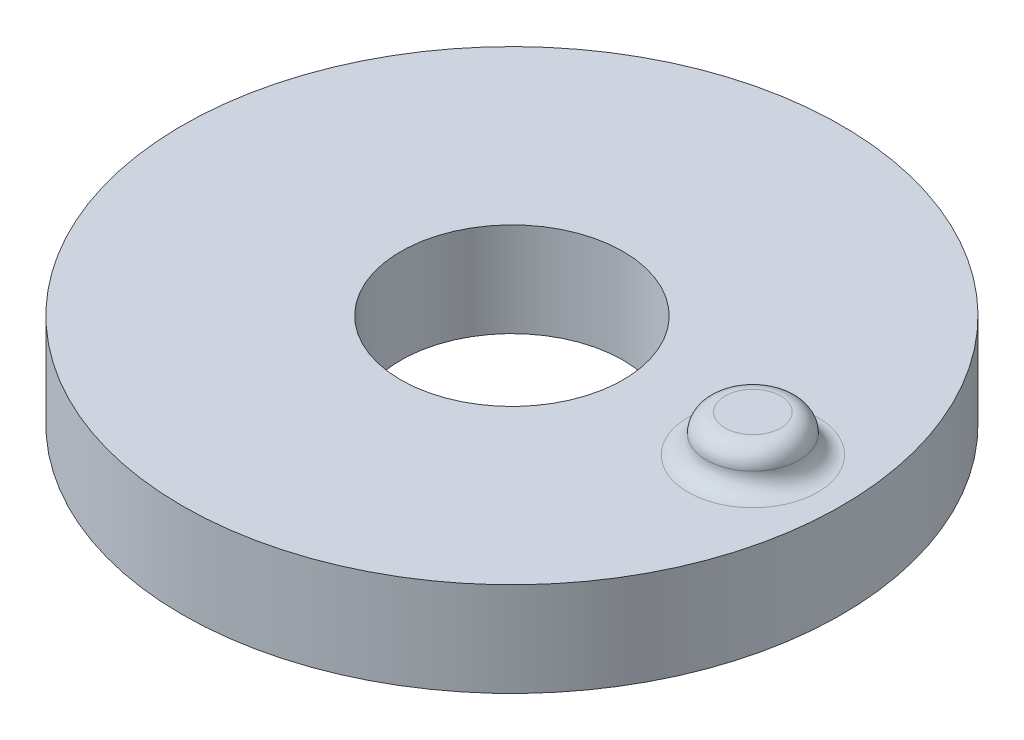
ISO-10303-21;
HEADER;
FILE_DESCRIPTION(('STEP AP214'),'2;1');
FILE_NAME('part.step','',(''),(''),'','','');
FILE_SCHEMA(('AUTOMOTIVE_DESIGN { 1 0 10303 214 1 1 1 1 }'));
ENDSEC;
DATA;
#1=APPLICATION_CONTEXT('core data for automotive mechanical design processes');
#2=APPLICATION_PROTOCOL_DEFINITION('international standard','automotive_design',2000,#1);
#3=PRODUCT_CONTEXT('',#1,'mechanical');
#4=PRODUCT('Part','Part','',(#3));
#5=PRODUCT_RELATED_PRODUCT_CATEGORY('part','',(#4));
#6=PRODUCT_DEFINITION_FORMATION('','',#4);
#7=PRODUCT_DEFINITION_CONTEXT('part definition',#1,'design');
#8=PRODUCT_DEFINITION('design','',#6,#7);
#9=PRODUCT_DEFINITION_SHAPE('','',#8);
#10=(LENGTH_UNIT() NAMED_UNIT(*) SI_UNIT(.MILLI.,.METRE.));
#11=(NAMED_UNIT(*) PLANE_ANGLE_UNIT() SI_UNIT($,.RADIAN.));
#12=(NAMED_UNIT(*) SI_UNIT($,.STERADIAN.) SOLID_ANGLE_UNIT());
#13=UNCERTAINTY_MEASURE_WITH_UNIT(LENGTH_MEASURE(1.E-05),#10,'distance_accuracy_value','');
#14=(GEOMETRIC_REPRESENTATION_CONTEXT(3) GLOBAL_UNCERTAINTY_ASSIGNED_CONTEXT((#13)) GLOBAL_UNIT_ASSIGNED_CONTEXT((#10,
#11,#12)) REPRESENTATION_CONTEXT('',''));
#15=CARTESIAN_POINT('',(0.,0.,0.));
#16=DIRECTION('',(0.,0.,1.));
#17=DIRECTION('',(1.,0.,0.));
#18=AXIS2_PLACEMENT_3D('',#15,#16,#17);
#19=CARTESIAN_POINT('',(0.,25.4,0.));
#20=DIRECTION('',(0.,-1.,0.));
#21=DIRECTION('',(0.,0.,-1.));
#22=AXIS2_PLACEMENT_3D('',#19,#20,#21);
#23=CYLINDRICAL_SURFACE('',#22,88.9);
#24=CARTESIAN_POINT('',(0.,25.4,0.));
#25=DIRECTION('',(0.,1.,0.));
#26=DIRECTION('',(0.,0.,1.));
#27=AXIS2_PLACEMENT_3D('',#24,#25,#26);
#28=CIRCLE('',#27,88.9);
#29=CARTESIAN_POINT('',(0.,25.4,88.9));
#30=VERTEX_POINT('',#29);
#31=EDGE_CURVE('E43',#30,#30,#28,.T.);
#32=ORIENTED_EDGE('',*,*,#31,.F.);
#33=EDGE_LOOP('',(#32));
#34=FACE_BOUND('',#33,.T.);
#35=CARTESIAN_POINT('',(0.,0.,0.));
#36=DIRECTION('',(0.,1.,0.));
#37=DIRECTION('',(0.,0.,1.));
#38=AXIS2_PLACEMENT_3D('',#35,#36,#37);
#39=CIRCLE('',#38,88.9);
#40=CARTESIAN_POINT('',(0.,0.,88.9));
#41=VERTEX_POINT('',#40);
#42=EDGE_CURVE('E46',#41,#41,#39,.T.);
#43=ORIENTED_EDGE('',*,*,#42,.T.);
#44=EDGE_LOOP('',(#43));
#45=FACE_BOUND('',#44,.T.);
#46=ADVANCED_FACE('F31',(#34,#45),#23,.T.);
#47=CARTESIAN_POINT('',(0.,25.4,0.));
#48=DIRECTION('',(0.,1.,0.));
#49=DIRECTION('',(0.,0.,1.));
#50=AXIS2_PLACEMENT_3D('',#47,#48,#49);
#51=PLANE('',#50);
#52=CARTESIAN_POINT('',(0.,25.4,0.));
#53=DIRECTION('',(0.,1.,0.));
#54=DIRECTION('',(0.,0.,1.));
#55=AXIS2_PLACEMENT_3D('',#52,#53,#54);
#56=CIRCLE('',#55,30.);
#57=CARTESIAN_POINT('',(0.,25.4,30.));
#58=VERTEX_POINT('',#57);
#59=EDGE_CURVE('E51',#58,#58,#56,.T.);
#60=ORIENTED_EDGE('',*,*,#59,.F.);
#61=EDGE_LOOP('',(#60));
#62=FACE_BOUND('',#61,.T.);
#63=CARTESIAN_POINT('',(65.,25.4,0.));
#64=DIRECTION('',(0.,1.,0.));
#65=DIRECTION('',(0.,0.,1.));
#66=AXIS2_PLACEMENT_3D('',#63,#64,#65);
#67=CIRCLE('',#66,17.5);
#68=CARTESIAN_POINT('',(65.,25.4,17.5));
#69=VERTEX_POINT('',#68);
#70=EDGE_CURVE('E39',#69,#69,#67,.F.);
#71=ORIENTED_EDGE('',*,*,#70,.T.);
#72=EDGE_LOOP('',(#71));
#73=FACE_BOUND('',#72,.T.);
#74=ORIENTED_EDGE('',*,*,#31,.T.);
#75=EDGE_LOOP('',(#74));
#76=FACE_BOUND('',#75,.T.);
#77=ADVANCED_FACE('F75',(#62,#73,#76),#51,.T.);
#78=CARTESIAN_POINT('',(0.,0.,0.));
#79=DIRECTION('',(0.,1.,0.));
#80=DIRECTION('',(0.,0.,1.));
#81=AXIS2_PLACEMENT_3D('',#78,#79,#80);
#82=PLANE('',#81);
#83=CARTESIAN_POINT('',(0.,0.,0.));
#84=DIRECTION('',(0.,1.,0.));
#85=DIRECTION('',(0.,0.,1.));
#86=AXIS2_PLACEMENT_3D('',#83,#84,#85);
#87=CIRCLE('',#86,30.);
#88=CARTESIAN_POINT('',(0.,0.,30.));
#89=VERTEX_POINT('',#88);
#90=EDGE_CURVE('E54',#89,#89,#87,.T.);
#91=ORIENTED_EDGE('',*,*,#90,.T.);
#92=EDGE_LOOP('',(#91));
#93=FACE_BOUND('',#92,.T.);
#94=ORIENTED_EDGE('',*,*,#42,.F.);
#95=EDGE_LOOP('',(#94));
#96=FACE_BOUND('',#95,.T.);
#97=ADVANCED_FACE('F72',(#93,#96),#82,.F.);
#98=CARTESIAN_POINT('',(65.,35.4,0.));
#99=DIRECTION('',(0.,1.,0.));
#100=DIRECTION('',(0.,0.,1.));
#101=AXIS2_PLACEMENT_3D('',#98,#99,#100);
#102=PLANE('',#101);
#103=CARTESIAN_POINT('',(65.,35.4,0.));
#104=DIRECTION('',(0.,1.,0.));
#105=DIRECTION('',(0.,0.,1.));
#106=AXIS2_PLACEMENT_3D('',#103,#104,#105);
#107=CIRCLE('',#106,7.5);
#108=CARTESIAN_POINT('',(65.,35.4,7.5));
#109=VERTEX_POINT('',#108);
#110=EDGE_CURVE('E10',#109,#109,#107,.T.);
#111=ORIENTED_EDGE('',*,*,#110,.T.);
#112=EDGE_LOOP('',(#111));
#113=FACE_BOUND('',#112,.T.);
#114=ADVANCED_FACE('F64',(#113),#102,.T.);
#115=CARTESIAN_POINT('',(65.,30.4,0.));
#116=DIRECTION('',(0.,1.,0.));
#117=DIRECTION('',(0.,0.,1.));
#118=AXIS2_PLACEMENT_3D('',#115,#116,#117);
#119=TOROIDAL_SURFACE('',#118,7.5,5.);
#120=ORIENTED_EDGE('',*,*,#110,.F.);
#121=EDGE_LOOP('',(#120));
#122=FACE_BOUND('',#121,.T.);
#123=CARTESIAN_POINT('',(65.,30.4,0.));
#124=DIRECTION('',(0.,1.,0.));
#125=DIRECTION('',(0.,0.,1.));
#126=AXIS2_PLACEMENT_3D('',#123,#124,#125);
#127=CIRCLE('',#126,12.5);
#128=CARTESIAN_POINT('',(65.,30.4,12.5));
#129=VERTEX_POINT('',#128);
#130=EDGE_CURVE('E35',#129,#129,#127,.F.);
#131=ORIENTED_EDGE('',*,*,#130,.F.);
#132=EDGE_LOOP('',(#131));
#133=FACE_BOUND('',#132,.T.);
#134=ADVANCED_FACE('F33',(#122,#133),#119,.T.);
#135=CARTESIAN_POINT('',(65.,30.4,0.));
#136=DIRECTION('',(0.,1.,0.));
#137=DIRECTION('',(0.,0.,1.));
#138=AXIS2_PLACEMENT_3D('',#135,#136,#137);
#139=TOROIDAL_SURFACE('',#138,17.5,5.);
#140=ORIENTED_EDGE('',*,*,#70,.F.);
#141=EDGE_LOOP('',(#140));
#142=FACE_BOUND('',#141,.T.);
#143=ORIENTED_EDGE('',*,*,#130,.T.);
#144=EDGE_LOOP('',(#143));
#145=FACE_BOUND('',#144,.T.);
#146=ADVANCED_FACE('F61',(#142,#145),#139,.F.);
#147=CARTESIAN_POINT('',(0.,0.,0.));
#148=DIRECTION('',(0.,1.,0.));
#149=DIRECTION('',(0.,0.,1.));
#150=AXIS2_PLACEMENT_3D('',#147,#148,#149);
#151=CYLINDRICAL_SURFACE('',#150,30.);
#152=ORIENTED_EDGE('',*,*,#90,.F.);
#153=EDGE_LOOP('',(#152));
#154=FACE_BOUND('',#153,.T.);
#155=ORIENTED_EDGE('',*,*,#59,.T.);
#156=EDGE_LOOP('',(#155));
#157=FACE_BOUND('',#156,.T.);
#158=ADVANCED_FACE('F70',(#154,#157),#151,.F.);
#159=CLOSED_SHELL('',(#46,#77,#97,#114,#134,#146,#158));
#160=MANIFOLD_SOLID_BREP('B2',#159);
#161=ADVANCED_BREP_SHAPE_REPRESENTATION('',(#18,#160),#14);
#162=SHAPE_DEFINITION_REPRESENTATION(#9,#161);
ENDSEC;
END-ISO-10303-21;
